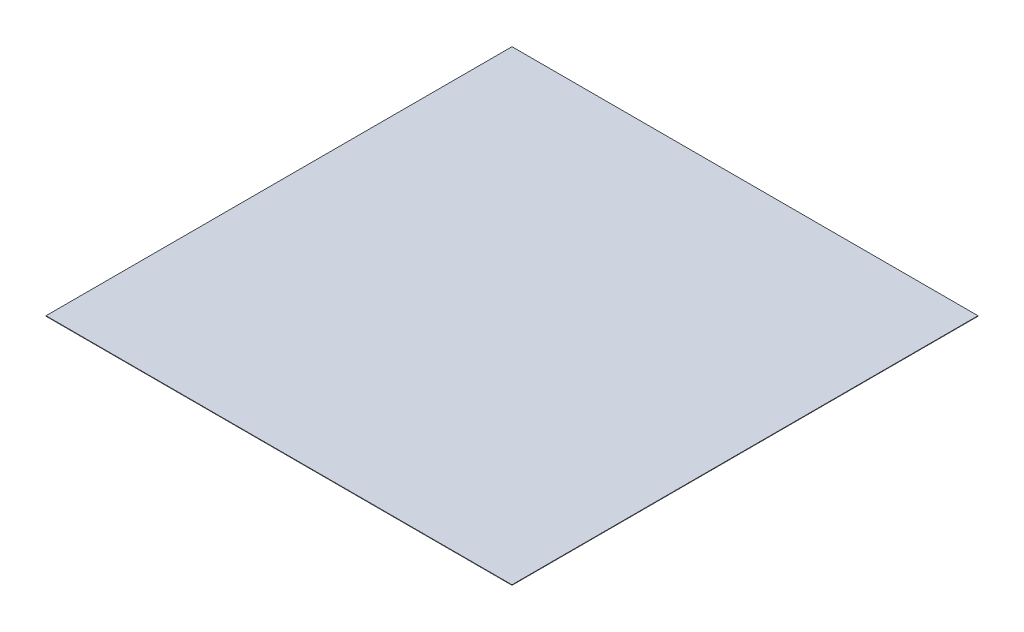
ISO-10303-21;
HEADER;
FILE_DESCRIPTION(('STEP AP214'),'2;1');
FILE_NAME('part.step','',(''),(''),'','','');
FILE_SCHEMA(('AUTOMOTIVE_DESIGN { 1 0 10303 214 1 1 1 1 }'));
ENDSEC;
DATA;
#1=APPLICATION_CONTEXT('core data for automotive mechanical design processes');
#2=APPLICATION_PROTOCOL_DEFINITION('international standard','automotive_design',2000,#1);
#3=PRODUCT_CONTEXT('',#1,'mechanical');
#4=PRODUCT('Part','Part','',(#3));
#5=PRODUCT_RELATED_PRODUCT_CATEGORY('part','',(#4));
#6=PRODUCT_DEFINITION_FORMATION('','',#4);
#7=PRODUCT_DEFINITION_CONTEXT('part definition',#1,'design');
#8=PRODUCT_DEFINITION('design','',#6,#7);
#9=PRODUCT_DEFINITION_SHAPE('','',#8);
#10=(LENGTH_UNIT() NAMED_UNIT(*) SI_UNIT(.MILLI.,.METRE.));
#11=(NAMED_UNIT(*) PLANE_ANGLE_UNIT() SI_UNIT($,.RADIAN.));
#12=(NAMED_UNIT(*) SI_UNIT($,.STERADIAN.) SOLID_ANGLE_UNIT());
#13=UNCERTAINTY_MEASURE_WITH_UNIT(LENGTH_MEASURE(1.E-05),#10,'distance_accuracy_value','');
#14=(GEOMETRIC_REPRESENTATION_CONTEXT(3) GLOBAL_UNCERTAINTY_ASSIGNED_CONTEXT((#13)) GLOBAL_UNIT_ASSIGNED_CONTEXT((#10,
#11,#12)) REPRESENTATION_CONTEXT('',''));
#15=CARTESIAN_POINT('',(0.,0.,0.));
#16=DIRECTION('',(0.,0.,1.));
#17=DIRECTION('',(1.,0.,0.));
#18=AXIS2_PLACEMENT_3D('',#15,#16,#17);
#19=CARTESIAN_POINT('',(-101.6,0.2032,101.6));
#20=DIRECTION('',(-1.,0.,0.));
#21=DIRECTION('',(0.,0.,1.));
#22=AXIS2_PLACEMENT_3D('',#19,#20,#21);
#23=PLANE('',#22);
#24=DIRECTION('',(0.,0.,-1.));
#25=VECTOR('',#24,1.);
#26=CARTESIAN_POINT('',(-101.6,0.,101.6));
#27=LINE('',#26,#25);
#28=CARTESIAN_POINT('',(-101.6,0.,101.6));
#29=VERTEX_POINT('',#28);
#30=CARTESIAN_POINT('',(-101.6,0.,-101.6));
#31=VERTEX_POINT('',#30);
#32=EDGE_CURVE('E105',#29,#31,#27,.T.);
#33=ORIENTED_EDGE('',*,*,#32,.F.);
#34=DIRECTION('',(0.,-1.,0.));
#35=VECTOR('',#34,1.);
#36=CARTESIAN_POINT('',(-101.6,0.2032,101.6));
#37=LINE('',#36,#35);
#38=CARTESIAN_POINT('',(-101.6,0.2032,101.6));
#39=VERTEX_POINT('',#38);
#40=EDGE_CURVE('E11',#39,#29,#37,.T.);
#41=ORIENTED_EDGE('',*,*,#40,.F.);
#42=DIRECTION('',(0.,0.,-1.));
#43=VECTOR('',#42,1.);
#44=CARTESIAN_POINT('',(-101.6,0.2032,101.6));
#45=LINE('',#44,#43);
#46=CARTESIAN_POINT('',(-101.6,0.2032,-101.6));
#47=VERTEX_POINT('',#46);
#48=EDGE_CURVE('E100',#39,#47,#45,.T.);
#49=ORIENTED_EDGE('',*,*,#48,.T.);
#50=DIRECTION('',(0.,-1.,0.));
#51=VECTOR('',#50,1.);
#52=CARTESIAN_POINT('',(-101.6,0.2032,-101.6));
#53=LINE('',#52,#51);
#54=EDGE_CURVE('E43',#47,#31,#53,.T.);
#55=ORIENTED_EDGE('',*,*,#54,.T.);
#56=EDGE_LOOP('',(#33,#41,#49,#55));
#57=FACE_BOUND('',#56,.T.);
#58=ADVANCED_FACE('F40',(#57),#23,.T.);
#59=CARTESIAN_POINT('',(-101.6,0.2032,101.6));
#60=DIRECTION('',(0.,0.,-1.));
#61=DIRECTION('',(-1.,0.,0.));
#62=AXIS2_PLACEMENT_3D('',#59,#60,#61);
#63=PLANE('',#62);
#64=DIRECTION('',(1.,0.,0.));
#65=VECTOR('',#64,1.);
#66=CARTESIAN_POINT('',(-101.6,0.,101.6));
#67=LINE('',#66,#65);
#68=CARTESIAN_POINT('',(101.6,0.,101.6));
#69=VERTEX_POINT('',#68);
#70=EDGE_CURVE('E73',#29,#69,#67,.T.);
#71=ORIENTED_EDGE('',*,*,#70,.T.);
#72=DIRECTION('',(0.,-1.,0.));
#73=VECTOR('',#72,1.);
#74=CARTESIAN_POINT('',(101.6,0.2032,101.6));
#75=LINE('',#74,#73);
#76=CARTESIAN_POINT('',(101.6,0.2032,101.6));
#77=VERTEX_POINT('',#76);
#78=EDGE_CURVE('E49',#77,#69,#75,.T.);
#79=ORIENTED_EDGE('',*,*,#78,.F.);
#80=DIRECTION('',(1.,0.,0.));
#81=VECTOR('',#80,1.);
#82=CARTESIAN_POINT('',(-101.6,0.2032,101.6));
#83=LINE('',#82,#81);
#84=EDGE_CURVE('E90',#39,#77,#83,.T.);
#85=ORIENTED_EDGE('',*,*,#84,.F.);
#86=ORIENTED_EDGE('',*,*,#40,.T.);
#87=EDGE_LOOP('',(#71,#79,#85,#86));
#88=FACE_BOUND('',#87,.T.);
#89=ADVANCED_FACE('F115',(#88),#63,.F.);
#90=CARTESIAN_POINT('',(101.6,0.2032,101.6));
#91=DIRECTION('',(-1.,0.,0.));
#92=DIRECTION('',(0.,0.,1.));
#93=AXIS2_PLACEMENT_3D('',#90,#91,#92);
#94=PLANE('',#93);
#95=DIRECTION('',(0.,0.,-1.));
#96=VECTOR('',#95,1.);
#97=CARTESIAN_POINT('',(101.6,0.,101.6));
#98=LINE('',#97,#96);
#99=CARTESIAN_POINT('',(101.6,0.,-101.6));
#100=VERTEX_POINT('',#99);
#101=EDGE_CURVE('E97',#69,#100,#98,.T.);
#102=ORIENTED_EDGE('',*,*,#101,.T.);
#103=DIRECTION('',(0.,-1.,0.));
#104=VECTOR('',#103,1.);
#105=CARTESIAN_POINT('',(101.6,0.2032,-101.6));
#106=LINE('',#105,#104);
#107=CARTESIAN_POINT('',(101.6,0.2032,-101.6));
#108=VERTEX_POINT('',#107);
#109=EDGE_CURVE('E94',#108,#100,#106,.T.);
#110=ORIENTED_EDGE('',*,*,#109,.F.);
#111=DIRECTION('',(0.,0.,-1.));
#112=VECTOR('',#111,1.);
#113=CARTESIAN_POINT('',(101.6,0.2032,101.6));
#114=LINE('',#113,#112);
#115=EDGE_CURVE('E85',#77,#108,#114,.T.);
#116=ORIENTED_EDGE('',*,*,#115,.F.);
#117=ORIENTED_EDGE('',*,*,#78,.T.);
#118=EDGE_LOOP('',(#102,#110,#116,#117));
#119=FACE_BOUND('',#118,.T.);
#120=ADVANCED_FACE('F95',(#119),#94,.F.);
#121=CARTESIAN_POINT('',(-101.6,0.2032,-101.6));
#122=DIRECTION('',(0.,0.,-1.));
#123=DIRECTION('',(-1.,0.,0.));
#124=AXIS2_PLACEMENT_3D('',#121,#122,#123);
#125=PLANE('',#124);
#126=DIRECTION('',(1.,0.,0.));
#127=VECTOR('',#126,1.);
#128=CARTESIAN_POINT('',(-101.6,0.,-101.6));
#129=LINE('',#128,#127);
#130=EDGE_CURVE('E108',#31,#100,#129,.T.);
#131=ORIENTED_EDGE('',*,*,#130,.F.);
#132=ORIENTED_EDGE('',*,*,#54,.F.);
#133=DIRECTION('',(1.,0.,0.));
#134=VECTOR('',#133,1.);
#135=CARTESIAN_POINT('',(-101.6,0.2032,-101.6));
#136=LINE('',#135,#134);
#137=EDGE_CURVE('E89',#47,#108,#136,.T.);
#138=ORIENTED_EDGE('',*,*,#137,.T.);
#139=ORIENTED_EDGE('',*,*,#109,.T.);
#140=EDGE_LOOP('',(#131,#132,#138,#139));
#141=FACE_BOUND('',#140,.T.);
#142=ADVANCED_FACE('F99',(#141),#125,.T.);
#143=CARTESIAN_POINT('',(0.,0.2032,0.));
#144=DIRECTION('',(0.,-1.,0.));
#145=DIRECTION('',(0.,0.,-1.));
#146=AXIS2_PLACEMENT_3D('',#143,#144,#145);
#147=PLANE('',#146);
#148=ORIENTED_EDGE('',*,*,#48,.F.);
#149=ORIENTED_EDGE('',*,*,#84,.T.);
#150=ORIENTED_EDGE('',*,*,#115,.T.);
#151=ORIENTED_EDGE('',*,*,#137,.F.);
#152=EDGE_LOOP('',(#148,#149,#150,#151));
#153=FACE_BOUND('',#152,.T.);
#154=ADVANCED_FACE('F88',(#153),#147,.F.);
#155=CARTESIAN_POINT('',(0.,0.,0.));
#156=DIRECTION('',(0.,-1.,0.));
#157=DIRECTION('',(0.,0.,-1.));
#158=AXIS2_PLACEMENT_3D('',#155,#156,#157);
#159=PLANE('',#158);
#160=ORIENTED_EDGE('',*,*,#32,.T.);
#161=ORIENTED_EDGE('',*,*,#130,.T.);
#162=ORIENTED_EDGE('',*,*,#101,.F.);
#163=ORIENTED_EDGE('',*,*,#70,.F.);
#164=EDGE_LOOP('',(#160,#161,#162,#163));
#165=FACE_BOUND('',#164,.T.);
#166=ADVANCED_FACE('F113',(#165),#159,.T.);
#167=CLOSED_SHELL('',(#58,#89,#120,#142,#154,#166));
#168=MANIFOLD_SOLID_BREP('B2',#167);
#169=ADVANCED_BREP_SHAPE_REPRESENTATION('',(#18,#168),#14);
#170=SHAPE_DEFINITION_REPRESENTATION(#9,#169);
ENDSEC;
END-ISO-10303-21;
